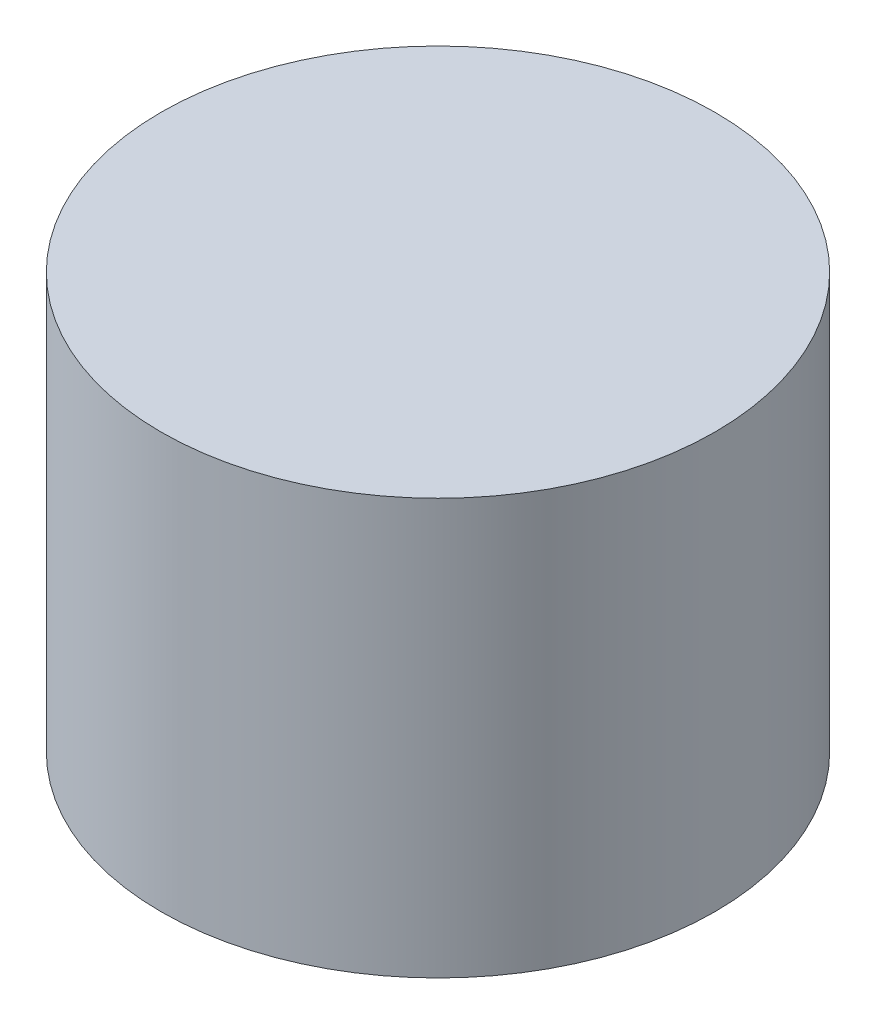
ISO-10303-21;
HEADER;
FILE_DESCRIPTION(('STEP AP214'),'2;1');
FILE_NAME('part.step','',(''),(''),'','','');
FILE_SCHEMA(('AUTOMOTIVE_DESIGN { 1 0 10303 214 1 1 1 1 }'));
ENDSEC;
DATA;
#1=APPLICATION_CONTEXT('core data for automotive mechanical design processes');
#2=APPLICATION_PROTOCOL_DEFINITION('international standard','automotive_design',2000,#1);
#3=PRODUCT_CONTEXT('',#1,'mechanical');
#4=PRODUCT('Part','Part','',(#3));
#5=PRODUCT_RELATED_PRODUCT_CATEGORY('part','',(#4));
#6=PRODUCT_DEFINITION_FORMATION('','',#4);
#7=PRODUCT_DEFINITION_CONTEXT('part definition',#1,'design');
#8=PRODUCT_DEFINITION('design','',#6,#7);
#9=PRODUCT_DEFINITION_SHAPE('','',#8);
#10=(LENGTH_UNIT() NAMED_UNIT(*) SI_UNIT(.MILLI.,.METRE.));
#11=(NAMED_UNIT(*) PLANE_ANGLE_UNIT() SI_UNIT($,.RADIAN.));
#12=(NAMED_UNIT(*) SI_UNIT($,.STERADIAN.) SOLID_ANGLE_UNIT());
#13=UNCERTAINTY_MEASURE_WITH_UNIT(LENGTH_MEASURE(1.E-05),#10,'distance_accuracy_value','');
#14=(GEOMETRIC_REPRESENTATION_CONTEXT(3) GLOBAL_UNCERTAINTY_ASSIGNED_CONTEXT((#13)) GLOBAL_UNIT_ASSIGNED_CONTEXT((#10,
#11,#12)) REPRESENTATION_CONTEXT('',''));
#15=CARTESIAN_POINT('',(0.,0.,0.));
#16=DIRECTION('',(0.,0.,1.));
#17=DIRECTION('',(1.,0.,0.));
#18=AXIS2_PLACEMENT_3D('',#15,#16,#17);
#19=CARTESIAN_POINT('',(0.,60.,0.));
#20=DIRECTION('',(0.,-1.,0.));
#21=DIRECTION('',(0.,0.,-1.));
#22=AXIS2_PLACEMENT_3D('',#19,#20,#21);
#23=CYLINDRICAL_SURFACE('',#22,40.);
#24=CARTESIAN_POINT('',(0.,60.,0.));
#25=DIRECTION('',(0.,1.,0.));
#26=DIRECTION('',(0.,0.,1.));
#27=AXIS2_PLACEMENT_3D('',#24,#25,#26);
#28=CIRCLE('',#27,40.);
#29=CARTESIAN_POINT('',(0.,60.,40.));
#30=VERTEX_POINT('',#29);
#31=EDGE_CURVE('E10',#30,#30,#28,.T.);
#32=ORIENTED_EDGE('',*,*,#31,.F.);
#33=EDGE_LOOP('',(#32));
#34=FACE_BOUND('',#33,.T.);
#35=CARTESIAN_POINT('',(0.,0.,0.));
#36=DIRECTION('',(0.,1.,0.));
#37=DIRECTION('',(0.,0.,1.));
#38=AXIS2_PLACEMENT_3D('',#35,#36,#37);
#39=CIRCLE('',#38,40.);
#40=CARTESIAN_POINT('',(0.,0.,40.));
#41=VERTEX_POINT('',#40);
#42=EDGE_CURVE('E42',#41,#41,#39,.T.);
#43=ORIENTED_EDGE('',*,*,#42,.T.);
#44=EDGE_LOOP('',(#43));
#45=FACE_BOUND('',#44,.T.);
#46=ADVANCED_FACE('F39',(#34,#45),#23,.T.);
#47=CARTESIAN_POINT('',(0.,60.,0.));
#48=DIRECTION('',(0.,1.,0.));
#49=DIRECTION('',(0.,0.,1.));
#50=AXIS2_PLACEMENT_3D('',#47,#48,#49);
#51=PLANE('',#50);
#52=ORIENTED_EDGE('',*,*,#31,.T.);
#53=EDGE_LOOP('',(#52));
#54=FACE_BOUND('',#53,.T.);
#55=ADVANCED_FACE('F54',(#54),#51,.T.);
#56=CARTESIAN_POINT('',(0.,0.,0.));
#57=DIRECTION('',(0.,1.,0.));
#58=DIRECTION('',(0.,0.,1.));
#59=AXIS2_PLACEMENT_3D('',#56,#57,#58);
#60=PLANE('',#59);
#61=ORIENTED_EDGE('',*,*,#42,.F.);
#62=EDGE_LOOP('',(#61));
#63=FACE_BOUND('',#62,.T.);
#64=ADVANCED_FACE('F52',(#63),#60,.F.);
#65=CLOSED_SHELL('',(#46,#55,#64));
#66=MANIFOLD_SOLID_BREP('B2',#65);
#67=ADVANCED_BREP_SHAPE_REPRESENTATION('',(#18,#66),#14);
#68=SHAPE_DEFINITION_REPRESENTATION(#9,#67);
ENDSEC;
END-ISO-10303-21;
